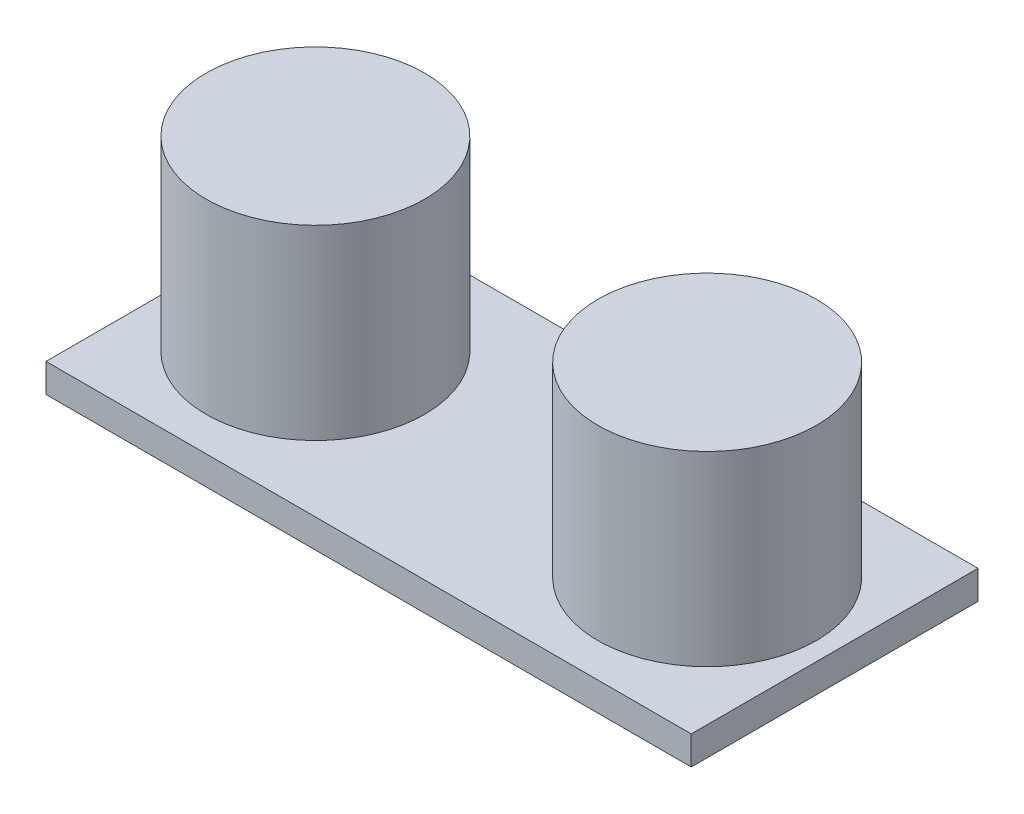
ISO-10303-21;
HEADER;
FILE_DESCRIPTION(('STEP AP214'),'2;1');
FILE_NAME('part.step','',(''),(''),'','','');
FILE_SCHEMA(('AUTOMOTIVE_DESIGN { 1 0 10303 214 1 1 1 1 }'));
ENDSEC;
DATA;
#1=APPLICATION_CONTEXT('core data for automotive mechanical design processes');
#2=APPLICATION_PROTOCOL_DEFINITION('international standard','automotive_design',2000,#1);
#3=PRODUCT_CONTEXT('',#1,'mechanical');
#4=PRODUCT('Part','Part','',(#3));
#5=PRODUCT_RELATED_PRODUCT_CATEGORY('part','',(#4));
#6=PRODUCT_DEFINITION_FORMATION('','',#4);
#7=PRODUCT_DEFINITION_CONTEXT('part definition',#1,'design');
#8=PRODUCT_DEFINITION('design','',#6,#7);
#9=PRODUCT_DEFINITION_SHAPE('','',#8);
#10=(LENGTH_UNIT() NAMED_UNIT(*) SI_UNIT(.MILLI.,.METRE.));
#11=(NAMED_UNIT(*) PLANE_ANGLE_UNIT() SI_UNIT($,.RADIAN.));
#12=(NAMED_UNIT(*) SI_UNIT($,.STERADIAN.) SOLID_ANGLE_UNIT());
#13=UNCERTAINTY_MEASURE_WITH_UNIT(LENGTH_MEASURE(1.E-05),#10,'distance_accuracy_value','');
#14=(GEOMETRIC_REPRESENTATION_CONTEXT(3) GLOBAL_UNCERTAINTY_ASSIGNED_CONTEXT((#13)) GLOBAL_UNIT_ASSIGNED_CONTEXT((#10,
#11,#12)) REPRESENTATION_CONTEXT('',''));
#15=CARTESIAN_POINT('',(0.,0.,0.));
#16=DIRECTION('',(0.,0.,1.));
#17=DIRECTION('',(1.,0.,0.));
#18=AXIS2_PLACEMENT_3D('',#15,#16,#17);
#19=CARTESIAN_POINT('',(0.,2.,0.));
#20=DIRECTION('',(0.,-1.,0.));
#21=DIRECTION('',(0.,0.,-1.));
#22=AXIS2_PLACEMENT_3D('',#19,#20,#21);
#23=PLANE('',#22);
#24=CARTESIAN_POINT('',(8.78750664758066,2.,-10.));
#25=DIRECTION('',(0.,-1.,0.));
#26=DIRECTION('',(0.,0.,-1.));
#27=AXIS2_PLACEMENT_3D('',#24,#25,#26);
#28=CIRCLE('',#27,7.62);
#29=CARTESIAN_POINT('',(8.78750664758066,2.,-17.62));
#30=VERTEX_POINT('',#29);
#31=EDGE_CURVE('E42',#30,#30,#28,.F.);
#32=ORIENTED_EDGE('',*,*,#31,.F.);
#33=EDGE_LOOP('',(#32));
#34=FACE_BOUND('',#33,.T.);
#35=DIRECTION('',(0.,0.,1.));
#36=VECTOR('',#35,1.);
#37=CARTESIAN_POINT('',(0.,2.,0.));
#38=LINE('',#37,#36);
#39=CARTESIAN_POINT('',(0.,2.,-20.));
#40=VERTEX_POINT('',#39);
#41=CARTESIAN_POINT('',(0.,2.,0.));
#42=VERTEX_POINT('',#41);
#43=EDGE_CURVE('E86',#40,#42,#38,.T.);
#44=ORIENTED_EDGE('',*,*,#43,.T.);
#45=DIRECTION('',(1.,0.,0.));
#46=VECTOR('',#45,1.);
#47=CARTESIAN_POINT('',(0.,2.,0.));
#48=LINE('',#47,#46);
#49=CARTESIAN_POINT('',(45.,2.,0.));
#50=VERTEX_POINT('',#49);
#51=EDGE_CURVE('E81',#42,#50,#48,.T.);
#52=ORIENTED_EDGE('',*,*,#51,.T.);
#53=DIRECTION('',(0.,0.,-1.));
#54=VECTOR('',#53,1.);
#55=CARTESIAN_POINT('',(45.,2.,0.));
#56=LINE('',#55,#54);
#57=CARTESIAN_POINT('',(45.,2.,-20.));
#58=VERTEX_POINT('',#57);
#59=EDGE_CURVE('E84',#50,#58,#56,.T.);
#60=ORIENTED_EDGE('',*,*,#59,.T.);
#61=DIRECTION('',(-1.,0.,0.));
#62=VECTOR('',#61,1.);
#63=CARTESIAN_POINT('',(0.,2.,-20.));
#64=LINE('',#63,#62);
#65=EDGE_CURVE('E50',#58,#40,#64,.T.);
#66=ORIENTED_EDGE('',*,*,#65,.T.);
#67=EDGE_LOOP('',(#44,#52,#60,#66));
#68=FACE_BOUND('',#67,.T.);
#69=CARTESIAN_POINT('',(36.11,2.,-10.));
#70=DIRECTION('',(0.,-1.,0.));
#71=DIRECTION('',(0.,0.,-1.));
#72=AXIS2_PLACEMENT_3D('',#69,#70,#71);
#73=CIRCLE('',#72,7.62);
#74=CARTESIAN_POINT('',(36.11,2.,-17.62));
#75=VERTEX_POINT('',#74);
#76=EDGE_CURVE('E11',#75,#75,#73,.F.);
#77=ORIENTED_EDGE('',*,*,#76,.F.);
#78=EDGE_LOOP('',(#77));
#79=FACE_BOUND('',#78,.T.);
#80=ADVANCED_FACE('F33',(#34,#68,#79),#23,.F.);
#81=CARTESIAN_POINT('',(0.,2.,0.));
#82=DIRECTION('',(1.,0.,0.));
#83=DIRECTION('',(0.,0.,-1.));
#84=AXIS2_PLACEMENT_3D('',#81,#82,#83);
#85=PLANE('',#84);
#86=DIRECTION('',(0.,0.,1.));
#87=VECTOR('',#86,1.);
#88=CARTESIAN_POINT('',(0.,0.,0.));
#89=LINE('',#88,#87);
#90=CARTESIAN_POINT('',(0.,0.,-20.));
#91=VERTEX_POINT('',#90);
#92=CARTESIAN_POINT('',(0.,0.,0.));
#93=VERTEX_POINT('',#92);
#94=EDGE_CURVE('E101',#91,#93,#89,.T.);
#95=ORIENTED_EDGE('',*,*,#94,.T.);
#96=DIRECTION('',(0.,-1.,0.));
#97=VECTOR('',#96,1.);
#98=CARTESIAN_POINT('',(0.,2.,0.));
#99=LINE('',#98,#97);
#100=EDGE_CURVE('E92',#42,#93,#99,.T.);
#101=ORIENTED_EDGE('',*,*,#100,.F.);
#102=ORIENTED_EDGE('',*,*,#43,.F.);
#103=DIRECTION('',(0.,-1.,0.));
#104=VECTOR('',#103,1.);
#105=CARTESIAN_POINT('',(0.,2.,-20.));
#106=LINE('',#105,#104);
#107=EDGE_CURVE('E97',#40,#91,#106,.T.);
#108=ORIENTED_EDGE('',*,*,#107,.T.);
#109=EDGE_LOOP('',(#95,#101,#102,#108));
#110=FACE_BOUND('',#109,.T.);
#111=ADVANCED_FACE('F35',(#110),#85,.F.);
#112=CARTESIAN_POINT('',(0.,2.,0.));
#113=DIRECTION('',(0.,0.,-1.));
#114=DIRECTION('',(-1.,0.,0.));
#115=AXIS2_PLACEMENT_3D('',#112,#113,#114);
#116=PLANE('',#115);
#117=DIRECTION('',(1.,0.,0.));
#118=VECTOR('',#117,1.);
#119=CARTESIAN_POINT('',(0.,0.,0.));
#120=LINE('',#119,#118);
#121=CARTESIAN_POINT('',(45.,0.,0.));
#122=VERTEX_POINT('',#121);
#123=EDGE_CURVE('E91',#93,#122,#120,.T.);
#124=ORIENTED_EDGE('',*,*,#123,.T.);
#125=DIRECTION('',(0.,-1.,0.));
#126=VECTOR('',#125,1.);
#127=CARTESIAN_POINT('',(45.,2.,0.));
#128=LINE('',#127,#126);
#129=EDGE_CURVE('E89',#50,#122,#128,.T.);
#130=ORIENTED_EDGE('',*,*,#129,.F.);
#131=ORIENTED_EDGE('',*,*,#51,.F.);
#132=ORIENTED_EDGE('',*,*,#100,.T.);
#133=EDGE_LOOP('',(#124,#130,#131,#132));
#134=FACE_BOUND('',#133,.T.);
#135=ADVANCED_FACE('F90',(#134),#116,.F.);
#136=CARTESIAN_POINT('',(45.,2.,0.));
#137=DIRECTION('',(-1.,0.,0.));
#138=DIRECTION('',(0.,0.,1.));
#139=AXIS2_PLACEMENT_3D('',#136,#137,#138);
#140=PLANE('',#139);
#141=DIRECTION('',(0.,0.,-1.));
#142=VECTOR('',#141,1.);
#143=CARTESIAN_POINT('',(45.,0.,0.));
#144=LINE('',#143,#142);
#145=CARTESIAN_POINT('',(45.,0.,-20.));
#146=VERTEX_POINT('',#145);
#147=EDGE_CURVE('E67',#122,#146,#144,.T.);
#148=ORIENTED_EDGE('',*,*,#147,.T.);
#149=DIRECTION('',(0.,-1.,0.));
#150=VECTOR('',#149,1.);
#151=CARTESIAN_POINT('',(45.,2.,-20.));
#152=LINE('',#151,#150);
#153=EDGE_CURVE('E93',#58,#146,#152,.T.);
#154=ORIENTED_EDGE('',*,*,#153,.F.);
#155=ORIENTED_EDGE('',*,*,#59,.F.);
#156=ORIENTED_EDGE('',*,*,#129,.T.);
#157=EDGE_LOOP('',(#148,#154,#155,#156));
#158=FACE_BOUND('',#157,.T.);
#159=ADVANCED_FACE('F95',(#158),#140,.F.);
#160=CARTESIAN_POINT('',(0.,2.,-20.));
#161=DIRECTION('',(0.,0.,1.));
#162=DIRECTION('',(1.,0.,0.));
#163=AXIS2_PLACEMENT_3D('',#160,#161,#162);
#164=PLANE('',#163);
#165=DIRECTION('',(-1.,0.,0.));
#166=VECTOR('',#165,1.);
#167=CARTESIAN_POINT('',(0.,0.,-20.));
#168=LINE('',#167,#166);
#169=EDGE_CURVE('E73',#146,#91,#168,.T.);
#170=ORIENTED_EDGE('',*,*,#169,.T.);
#171=ORIENTED_EDGE('',*,*,#107,.F.);
#172=ORIENTED_EDGE('',*,*,#65,.F.);
#173=ORIENTED_EDGE('',*,*,#153,.T.);
#174=EDGE_LOOP('',(#170,#171,#172,#173));
#175=FACE_BOUND('',#174,.T.);
#176=ADVANCED_FACE('F127',(#175),#164,.F.);
#177=CARTESIAN_POINT('',(0.,0.,0.));
#178=DIRECTION('',(0.,-1.,0.));
#179=DIRECTION('',(0.,0.,-1.));
#180=AXIS2_PLACEMENT_3D('',#177,#178,#179);
#181=PLANE('',#180);
#182=ORIENTED_EDGE('',*,*,#94,.F.);
#183=ORIENTED_EDGE('',*,*,#169,.F.);
#184=ORIENTED_EDGE('',*,*,#147,.F.);
#185=ORIENTED_EDGE('',*,*,#123,.F.);
#186=EDGE_LOOP('',(#182,#183,#184,#185));
#187=FACE_BOUND('',#186,.T.);
#188=ADVANCED_FACE('F124',(#187),#181,.T.);
#189=CARTESIAN_POINT('',(8.78750664758066,15.,-10.));
#190=DIRECTION('',(0.,-1.,0.));
#191=DIRECTION('',(0.,0.,-1.));
#192=AXIS2_PLACEMENT_3D('',#189,#190,#191);
#193=CYLINDRICAL_SURFACE('',#192,7.62);
#194=CARTESIAN_POINT('',(8.78750664758066,15.,-10.));
#195=DIRECTION('',(0.,1.,0.));
#196=DIRECTION('',(0.,0.,1.));
#197=AXIS2_PLACEMENT_3D('',#194,#195,#196);
#198=CIRCLE('',#197,7.62);
#199=CARTESIAN_POINT('',(8.78750664758066,15.,-17.62));
#200=VERTEX_POINT('',#199);
#201=EDGE_CURVE('E104',#200,#200,#198,.T.);
#202=CARTESIAN_POINT('',(8.78750664758066,15.,-17.62));
#203=CARTESIAN_POINT('',(8.78750664758066,14.8645833333333,-17.62));
#204=CARTESIAN_POINT('',(8.78750664758066,14.7291666666667,-17.62));
#205=CARTESIAN_POINT('',(8.78750664758066,14.4583333333333,-17.62));
#206=CARTESIAN_POINT('',(8.78750664758066,14.3229166666667,-17.62));
#207=CARTESIAN_POINT('',(8.78750664758066,14.0520833333333,-17.62));
#208=CARTESIAN_POINT('',(8.78750664758066,13.9166666666667,-17.62));
#209=CARTESIAN_POINT('',(8.78750664758066,13.6458333333333,-17.62));
#210=CARTESIAN_POINT('',(8.78750664758066,13.5104166666667,-17.62));
#211=CARTESIAN_POINT('',(8.78750664758066,13.2395833333333,-17.62));
#212=CARTESIAN_POINT('',(8.78750664758066,13.1041666666667,-17.62));
#213=CARTESIAN_POINT('',(8.78750664758066,12.8333333333333,-17.62));
#214=CARTESIAN_POINT('',(8.78750664758066,12.6979166666667,-17.62));
#215=CARTESIAN_POINT('',(8.78750664758066,12.4270833333333,-17.62));
#216=CARTESIAN_POINT('',(8.78750664758066,12.2916666666667,-17.62));
#217=CARTESIAN_POINT('',(8.78750664758066,12.0208333333333,-17.62));
#218=CARTESIAN_POINT('',(8.78750664758066,11.8854166666667,-17.62));
#219=CARTESIAN_POINT('',(8.78750664758066,11.6145833333333,-17.62));
#220=CARTESIAN_POINT('',(8.78750664758066,11.4791666666667,-17.62));
#221=CARTESIAN_POINT('',(8.78750664758066,11.2083333333333,-17.62));
#222=CARTESIAN_POINT('',(8.78750664758066,11.0729166666667,-17.62));
#223=CARTESIAN_POINT('',(8.78750664758066,10.8020833333333,-17.62));
#224=CARTESIAN_POINT('',(8.78750664758066,10.6666666666667,-17.62));
#225=CARTESIAN_POINT('',(8.78750664758066,10.3958333333333,-17.62));
#226=CARTESIAN_POINT('',(8.78750664758066,10.2604166666667,-17.62));
#227=CARTESIAN_POINT('',(8.78750664758066,9.98958333333333,-17.62));
#228=CARTESIAN_POINT('',(8.78750664758066,9.85416666666667,-17.62));
#229=CARTESIAN_POINT('',(8.78750664758066,9.58333333333333,-17.62));
#230=CARTESIAN_POINT('',(8.78750664758066,9.44791666666667,-17.62));
#231=CARTESIAN_POINT('',(8.78750664758066,9.17708333333333,-17.62));
#232=CARTESIAN_POINT('',(8.78750664758066,9.04166666666666,-17.62));
#233=CARTESIAN_POINT('',(8.78750664758066,8.77083333333333,-17.62));
#234=CARTESIAN_POINT('',(8.78750664758066,8.63541666666667,-17.62));
#235=CARTESIAN_POINT('',(8.78750664758066,8.36458333333333,-17.62));
#236=CARTESIAN_POINT('',(8.78750664758066,8.22916666666667,-17.62));
#237=CARTESIAN_POINT('',(8.78750664758066,7.95833333333333,-17.62));
#238=CARTESIAN_POINT('',(8.78750664758066,7.82291666666667,-17.62));
#239=CARTESIAN_POINT('',(8.78750664758066,7.55208333333333,-17.62));
#240=CARTESIAN_POINT('',(8.78750664758066,7.41666666666667,-17.62));
#241=CARTESIAN_POINT('',(8.78750664758066,7.14583333333333,-17.62));
#242=CARTESIAN_POINT('',(8.78750664758066,7.01041666666667,-17.62));
#243=CARTESIAN_POINT('',(8.78750664758066,6.73958333333333,-17.62));
#244=CARTESIAN_POINT('',(8.78750664758066,6.60416666666667,-17.62));
#245=CARTESIAN_POINT('',(8.78750664758066,6.33333333333333,-17.62));
#246=CARTESIAN_POINT('',(8.78750664758066,6.19791666666667,-17.62));
#247=CARTESIAN_POINT('',(8.78750664758066,5.92708333333333,-17.62));
#248=CARTESIAN_POINT('',(8.78750664758066,5.79166666666667,-17.62));
#249=CARTESIAN_POINT('',(8.78750664758066,5.52083333333333,-17.62));
#250=CARTESIAN_POINT('',(8.78750664758066,5.38541666666667,-17.62));
#251=CARTESIAN_POINT('',(8.78750664758066,5.11458333333333,-17.62));
#252=CARTESIAN_POINT('',(8.78750664758066,4.97916666666667,-17.62));
#253=CARTESIAN_POINT('',(8.78750664758066,4.70833333333333,-17.62));
#254=CARTESIAN_POINT('',(8.78750664758066,4.57291666666667,-17.62));
#255=CARTESIAN_POINT('',(8.78750664758066,4.30208333333333,-17.62));
#256=CARTESIAN_POINT('',(8.78750664758066,4.16666666666667,-17.62));
#257=CARTESIAN_POINT('',(8.78750664758066,3.89583333333333,-17.62));
#258=CARTESIAN_POINT('',(8.78750664758066,3.76041666666667,-17.62));
#259=CARTESIAN_POINT('',(8.78750664758066,3.48958333333333,-17.62));
#260=CARTESIAN_POINT('',(8.78750664758066,3.35416666666667,-17.62));
#261=CARTESIAN_POINT('',(8.78750664758066,3.08333333333333,-17.62));
#262=CARTESIAN_POINT('',(8.78750664758066,2.94791666666667,-17.62));
#263=CARTESIAN_POINT('',(8.78750664758066,2.67708333333333,-17.62));
#264=CARTESIAN_POINT('',(8.78750664758066,2.54166666666667,-17.62));
#265=CARTESIAN_POINT('',(8.78750664758066,2.27083333333333,-17.62));
#266=CARTESIAN_POINT('',(8.78750664758066,2.13541666666667,-17.62));
#267=CARTESIAN_POINT('',(8.78750664758066,2.,-17.62));
#268=B_SPLINE_CURVE_WITH_KNOTS('',3,(#202,#203,#204,#205,#206,#207,#208,#209,#210,#211,#212,
#213,#214,#215,#216,#217,#218,#219,#220,#221,#222,#223,#224,#225,#226,#227,#228,#229,#230,#231,
#232,#233,#234,#235,#236,#237,#238,#239,#240,#241,#242,#243,#244,#245,#246,#247,#248,#249,#250,
#251,#252,#253,#254,#255,#256,#257,#258,#259,#260,#261,#262,#263,#264,#265,#266,#267),
.UNSPECIFIED.,.F.,.F.,(4,2,2,2,2,2,2,2,2,2,2,2,2,2,2,2,2,2,2,2,2,2,2,2,2,2,2,2,2,2,2,2,4),(0.,
0.40625,0.812500000000001,1.21875,1.625,2.03125,2.4375,2.84375,3.25,3.65625,4.0625,4.46875,
4.875,5.28125,5.6875,6.09375,6.5,6.90625,7.3125,7.71875,8.125,8.53125,8.9375,9.34375,9.75,
10.15625,10.5625,10.96875,11.375,11.78125,12.1875,12.59375,13.),.UNSPECIFIED.);
#269=EDGE_CURVE('BSEAM113',#200,#30,#268,.T.);
#270=ORIENTED_EDGE('',*,*,#201,.F.);
#271=ORIENTED_EDGE('',*,*,#31,.T.);
#272=ORIENTED_EDGE('',*,*,#269,.T.);
#273=ORIENTED_EDGE('',*,*,#269,.F.);
#274=EDGE_LOOP('',(#270,#272,#271,#273));
#275=FACE_BOUND('',#274,.T.);
#276=ADVANCED_FACE('F113',(#275),#193,.T.);
#277=CARTESIAN_POINT('',(8.78750664758066,15.,-10.));
#278=DIRECTION('',(0.,1.,0.));
#279=DIRECTION('',(0.,0.,1.));
#280=AXIS2_PLACEMENT_3D('',#277,#278,#279);
#281=PLANE('',#280);
#282=ORIENTED_EDGE('',*,*,#201,.T.);
#283=EDGE_LOOP('',(#282));
#284=FACE_BOUND('',#283,.T.);
#285=ADVANCED_FACE('F155',(#284),#281,.T.);
#286=CARTESIAN_POINT('',(36.11,15.,-10.));
#287=DIRECTION('',(0.,-1.,0.));
#288=DIRECTION('',(0.,0.,-1.));
#289=AXIS2_PLACEMENT_3D('',#286,#287,#288);
#290=CYLINDRICAL_SURFACE('',#289,7.62);
#291=CARTESIAN_POINT('',(36.11,15.,-10.));
#292=DIRECTION('',(0.,1.,0.));
#293=DIRECTION('',(0.,0.,1.));
#294=AXIS2_PLACEMENT_3D('',#291,#292,#293);
#295=CIRCLE('',#294,7.62);
#296=CARTESIAN_POINT('',(36.11,15.,-17.62));
#297=VERTEX_POINT('',#296);
#298=EDGE_CURVE('E206',#297,#297,#295,.T.);
#299=CARTESIAN_POINT('',(36.11,15.,-17.62));
#300=CARTESIAN_POINT('',(36.11,14.8645833333333,-17.62));
#301=CARTESIAN_POINT('',(36.11,14.7291666666667,-17.62));
#302=CARTESIAN_POINT('',(36.11,14.4583333333333,-17.62));
#303=CARTESIAN_POINT('',(36.11,14.3229166666667,-17.62));
#304=CARTESIAN_POINT('',(36.11,14.0520833333333,-17.62));
#305=CARTESIAN_POINT('',(36.11,13.9166666666667,-17.62));
#306=CARTESIAN_POINT('',(36.11,13.6458333333333,-17.62));
#307=CARTESIAN_POINT('',(36.11,13.5104166666667,-17.62));
#308=CARTESIAN_POINT('',(36.11,13.2395833333333,-17.62));
#309=CARTESIAN_POINT('',(36.11,13.1041666666667,-17.62));
#310=CARTESIAN_POINT('',(36.11,12.8333333333333,-17.62));
#311=CARTESIAN_POINT('',(36.11,12.6979166666667,-17.62));
#312=CARTESIAN_POINT('',(36.11,12.4270833333333,-17.62));
#313=CARTESIAN_POINT('',(36.11,12.2916666666667,-17.62));
#314=CARTESIAN_POINT('',(36.11,12.0208333333333,-17.62));
#315=CARTESIAN_POINT('',(36.11,11.8854166666667,-17.62));
#316=CARTESIAN_POINT('',(36.11,11.6145833333333,-17.62));
#317=CARTESIAN_POINT('',(36.11,11.4791666666667,-17.62));
#318=CARTESIAN_POINT('',(36.11,11.2083333333333,-17.62));
#319=CARTESIAN_POINT('',(36.11,11.0729166666667,-17.62));
#320=CARTESIAN_POINT('',(36.11,10.8020833333333,-17.62));
#321=CARTESIAN_POINT('',(36.11,10.6666666666667,-17.62));
#322=CARTESIAN_POINT('',(36.11,10.3958333333333,-17.62));
#323=CARTESIAN_POINT('',(36.11,10.2604166666667,-17.62));
#324=CARTESIAN_POINT('',(36.11,9.98958333333333,-17.62));
#325=CARTESIAN_POINT('',(36.11,9.85416666666667,-17.62));
#326=CARTESIAN_POINT('',(36.11,9.58333333333333,-17.62));
#327=CARTESIAN_POINT('',(36.11,9.44791666666667,-17.62));
#328=CARTESIAN_POINT('',(36.11,9.17708333333333,-17.62));
#329=CARTESIAN_POINT('',(36.11,9.04166666666666,-17.62));
#330=CARTESIAN_POINT('',(36.11,8.77083333333333,-17.62));
#331=CARTESIAN_POINT('',(36.11,8.63541666666667,-17.62));
#332=CARTESIAN_POINT('',(36.11,8.36458333333333,-17.62));
#333=CARTESIAN_POINT('',(36.11,8.22916666666667,-17.62));
#334=CARTESIAN_POINT('',(36.11,7.95833333333333,-17.62));
#335=CARTESIAN_POINT('',(36.11,7.82291666666667,-17.62));
#336=CARTESIAN_POINT('',(36.11,7.55208333333333,-17.62));
#337=CARTESIAN_POINT('',(36.11,7.41666666666667,-17.62));
#338=CARTESIAN_POINT('',(36.11,7.14583333333333,-17.62));
#339=CARTESIAN_POINT('',(36.11,7.01041666666667,-17.62));
#340=CARTESIAN_POINT('',(36.11,6.73958333333333,-17.62));
#341=CARTESIAN_POINT('',(36.11,6.60416666666667,-17.62));
#342=CARTESIAN_POINT('',(36.11,6.33333333333333,-17.62));
#343=CARTESIAN_POINT('',(36.11,6.19791666666667,-17.62));
#344=CARTESIAN_POINT('',(36.11,5.92708333333333,-17.62));
#345=CARTESIAN_POINT('',(36.11,5.79166666666667,-17.62));
#346=CARTESIAN_POINT('',(36.11,5.52083333333333,-17.62));
#347=CARTESIAN_POINT('',(36.11,5.38541666666667,-17.62));
#348=CARTESIAN_POINT('',(36.11,5.11458333333333,-17.62));
#349=CARTESIAN_POINT('',(36.11,4.97916666666667,-17.62));
#350=CARTESIAN_POINT('',(36.11,4.70833333333333,-17.62));
#351=CARTESIAN_POINT('',(36.11,4.57291666666667,-17.62));
#352=CARTESIAN_POINT('',(36.11,4.30208333333333,-17.62));
#353=CARTESIAN_POINT('',(36.11,4.16666666666667,-17.62));
#354=CARTESIAN_POINT('',(36.11,3.89583333333333,-17.62));
#355=CARTESIAN_POINT('',(36.11,3.76041666666667,-17.62));
#356=CARTESIAN_POINT('',(36.11,3.48958333333333,-17.62));
#357=CARTESIAN_POINT('',(36.11,3.35416666666667,-17.62));
#358=CARTESIAN_POINT('',(36.11,3.08333333333333,-17.62));
#359=CARTESIAN_POINT('',(36.11,2.94791666666667,-17.62));
#360=CARTESIAN_POINT('',(36.11,2.67708333333333,-17.62));
#361=CARTESIAN_POINT('',(36.11,2.54166666666667,-17.62));
#362=CARTESIAN_POINT('',(36.11,2.27083333333333,-17.62));
#363=CARTESIAN_POINT('',(36.11,2.13541666666667,-17.62));
#364=CARTESIAN_POINT('',(36.11,2.,-17.62));
#365=B_SPLINE_CURVE_WITH_KNOTS('',3,(#299,#300,#301,#302,#303,#304,#305,#306,#307,#308,#309,
#310,#311,#312,#313,#314,#315,#316,#317,#318,#319,#320,#321,#322,#323,#324,#325,#326,#327,#328,
#329,#330,#331,#332,#333,#334,#335,#336,#337,#338,#339,#340,#341,#342,#343,#344,#345,#346,#347,
#348,#349,#350,#351,#352,#353,#354,#355,#356,#357,#358,#359,#360,#361,#362,#363,#364),
.UNSPECIFIED.,.F.,.F.,(4,2,2,2,2,2,2,2,2,2,2,2,2,2,2,2,2,2,2,2,2,2,2,2,2,2,2,2,2,2,2,2,4),(0.,
0.40625,0.812500000000001,1.21875,1.625,2.03125,2.4375,2.84375,3.25,3.65625,4.0625,4.46875,
4.875,5.28125,5.6875,6.09375,6.5,6.90625,7.3125,7.71875,8.125,8.53125,8.9375,9.34375,9.75,
10.15625,10.5625,10.96875,11.375,11.78125,12.1875,12.59375,13.),.UNSPECIFIED.);
#366=EDGE_CURVE('BSEAM162',#297,#75,#365,.T.);
#367=ORIENTED_EDGE('',*,*,#298,.F.);
#368=ORIENTED_EDGE('',*,*,#76,.T.);
#369=ORIENTED_EDGE('',*,*,#366,.T.);
#370=ORIENTED_EDGE('',*,*,#366,.F.);
#371=EDGE_LOOP('',(#367,#369,#368,#370));
#372=FACE_BOUND('',#371,.T.);
#373=ADVANCED_FACE('F162',(#372),#290,.T.);
#374=CARTESIAN_POINT('',(36.11,15.,-10.));
#375=DIRECTION('',(0.,1.,0.));
#376=DIRECTION('',(0.,0.,1.));
#377=AXIS2_PLACEMENT_3D('',#374,#375,#376);
#378=PLANE('',#377);
#379=ORIENTED_EDGE('',*,*,#298,.T.);
#380=EDGE_LOOP('',(#379));
#381=FACE_BOUND('',#380,.T.);
#382=ADVANCED_FACE('F169',(#381),#378,.T.);
#383=CLOSED_SHELL('',(#80,#111,#135,#159,#176,#188,#276,#285,#373,#382));
#384=MANIFOLD_SOLID_BREP('B2',#383);
#385=ADVANCED_BREP_SHAPE_REPRESENTATION('',(#18,#384),#14);
#386=SHAPE_DEFINITION_REPRESENTATION(#9,#385);
ENDSEC;
END-ISO-10303-21;
